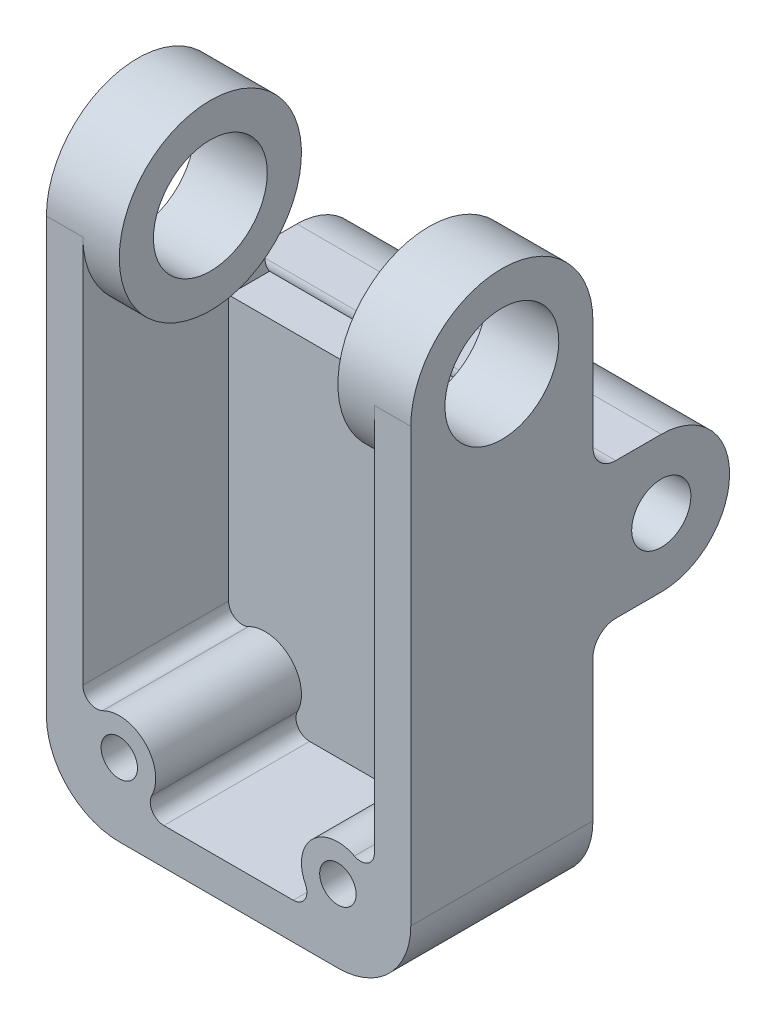
ISO-10303-21;
HEADER;
FILE_DESCRIPTION(('STEP AP214'),'2;1');
FILE_NAME('part.step','',(''),(''),'','','');
FILE_SCHEMA(('AUTOMOTIVE_DESIGN { 1 0 10303 214 1 1 1 1 }'));
ENDSEC;
DATA;
#1=APPLICATION_CONTEXT('core data for automotive mechanical design processes');
#2=APPLICATION_PROTOCOL_DEFINITION('international standard','automotive_design',2000,#1);
#3=PRODUCT_CONTEXT('',#1,'mechanical');
#4=PRODUCT('Part','Part','',(#3));
#5=PRODUCT_RELATED_PRODUCT_CATEGORY('part','',(#4));
#6=PRODUCT_DEFINITION_FORMATION('','',#4);
#7=PRODUCT_DEFINITION_CONTEXT('part definition',#1,'design');
#8=PRODUCT_DEFINITION('design','',#6,#7);
#9=PRODUCT_DEFINITION_SHAPE('','',#8);
#10=(LENGTH_UNIT() NAMED_UNIT(*) SI_UNIT(.MILLI.,.METRE.));
#11=(NAMED_UNIT(*) PLANE_ANGLE_UNIT() SI_UNIT($,.RADIAN.));
#12=(NAMED_UNIT(*) SI_UNIT($,.STERADIAN.) SOLID_ANGLE_UNIT());
#13=UNCERTAINTY_MEASURE_WITH_UNIT(LENGTH_MEASURE(1.E-05),#10,'distance_accuracy_value','');
#14=(GEOMETRIC_REPRESENTATION_CONTEXT(3) GLOBAL_UNCERTAINTY_ASSIGNED_CONTEXT((#13)) GLOBAL_UNIT_ASSIGNED_CONTEXT((#10,
#11,#12)) REPRESENTATION_CONTEXT('',''));
#15=CARTESIAN_POINT('',(0.,0.,0.));
#16=DIRECTION('',(0.,0.,1.));
#17=DIRECTION('',(1.,0.,0.));
#18=AXIS2_PLACEMENT_3D('',#15,#16,#17);
#19=CARTESIAN_POINT('',(0.,0.,0.));
#20=DIRECTION('',(0.,0.,-1.));
#21=DIRECTION('',(-1.,0.,0.));
#22=AXIS2_PLACEMENT_3D('',#19,#20,#21);
#23=PLANE('',#22);
#24=DIRECTION('',(0.,1.,0.));
#25=VECTOR('',#24,1.);
#26=CARTESIAN_POINT('',(40.,84.,0.));
#27=LINE('',#26,#25);
#28=CARTESIAN_POINT('',(40.,87.,0.));
#29=VERTEX_POINT('',#28);
#30=CARTESIAN_POINT('',(40.,111.,0.));
#31=VERTEX_POINT('',#30);
#32=EDGE_CURVE('E219',#29,#31,#27,.T.);
#33=ORIENTED_EDGE('',*,*,#32,.F.);
#34=DIRECTION('',(1.,0.,0.));
#35=VECTOR('',#34,1.);
#36=CARTESIAN_POINT('',(-40.,87.,0.));
#37=LINE('',#36,#35);
#38=CARTESIAN_POINT('',(32.,87.,0.));
#39=VERTEX_POINT('',#38);
#40=EDGE_CURVE('E266',#29,#39,#37,.F.);
#41=ORIENTED_EDGE('',*,*,#40,.T.);
#42=DIRECTION('',(0.,1.,0.));
#43=VECTOR('',#42,1.);
#44=CARTESIAN_POINT('',(32.,0.,0.));
#45=LINE('',#44,#43);
#46=CARTESIAN_POINT('',(32.,111.,0.));
#47=VERTEX_POINT('',#46);
#48=EDGE_CURVE('E451',#39,#47,#45,.T.);
#49=ORIENTED_EDGE('',*,*,#48,.T.);
#50=DIRECTION('',(1.,0.,0.));
#51=VECTOR('',#50,1.);
#52=CARTESIAN_POINT('',(32.,111.,0.));
#53=LINE('',#52,#51);
#54=EDGE_CURVE('E456',#47,#31,#53,.T.);
#55=ORIENTED_EDGE('',*,*,#54,.T.);
#56=EDGE_LOOP('',(#33,#41,#49,#55));
#57=FACE_BOUND('',#56,.T.);
#58=ADVANCED_FACE('F39',(#57),#23,.T.);
#59=DIRECTION('',(0.,1.,0.));
#60=VECTOR('',#59,1.);
#61=CARTESIAN_POINT('',(-32.,0.,0.));
#62=LINE('',#61,#60);
#63=CARTESIAN_POINT('',(-32.,87.,0.));
#64=VERTEX_POINT('',#63);
#65=CARTESIAN_POINT('',(-32.,111.,0.));
#66=VERTEX_POINT('',#65);
#67=EDGE_CURVE('E281',#64,#66,#62,.T.);
#68=ORIENTED_EDGE('',*,*,#67,.F.);
#69=DIRECTION('',(1.,0.,0.));
#70=VECTOR('',#69,1.);
#71=CARTESIAN_POINT('',(-40.,87.,0.));
#72=LINE('',#71,#70);
#73=CARTESIAN_POINT('',(-40.,87.,0.));
#74=VERTEX_POINT('',#73);
#75=EDGE_CURVE('E264',#64,#74,#72,.F.);
#76=ORIENTED_EDGE('',*,*,#75,.T.);
#77=DIRECTION('',(0.,-1.,0.));
#78=VECTOR('',#77,1.);
#79=CARTESIAN_POINT('',(-40.,0.,0.));
#80=LINE('',#79,#78);
#81=CARTESIAN_POINT('',(-40.,111.,0.));
#82=VERTEX_POINT('',#81);
#83=EDGE_CURVE('E228',#82,#74,#80,.T.);
#84=ORIENTED_EDGE('',*,*,#83,.F.);
#85=DIRECTION('',(-1.,0.,0.));
#86=VECTOR('',#85,1.);
#87=CARTESIAN_POINT('',(-32.,111.,0.));
#88=LINE('',#87,#86);
#89=EDGE_CURVE('E289',#66,#82,#88,.T.);
#90=ORIENTED_EDGE('',*,*,#89,.F.);
#91=EDGE_LOOP('',(#68,#76,#84,#90));
#92=FACE_BOUND('',#91,.T.);
#93=ADVANCED_FACE('F287',(#92),#23,.T.);
#94=CARTESIAN_POINT('',(-32.,111.,20.));
#95=DIRECTION('',(-1.,0.,0.));
#96=DIRECTION('',(0.,1.,0.));
#97=AXIS2_PLACEMENT_3D('',#94,#95,#96);
#98=PLANE('',#97);
#99=CARTESIAN_POINT('',(-32.,111.,20.));
#100=DIRECTION('',(1.,0.,0.));
#101=DIRECTION('',(0.,1.,0.));
#102=AXIS2_PLACEMENT_3D('',#99,#100,#101);
#103=CIRCLE('',#102,20.);
#104=CARTESIAN_POINT('',(-32.,111.,40.));
#105=VERTEX_POINT('',#104);
#106=EDGE_CURVE('E349',#105,#66,#103,.T.);
#107=ORIENTED_EDGE('',*,*,#106,.F.);
#108=DIRECTION('',(0.,-1.,0.));
#109=VECTOR('',#108,1.);
#110=CARTESIAN_POINT('',(-32.,0.,40.));
#111=LINE('',#110,#109);
#112=CARTESIAN_POINT('',(-32.,25.7979589711327,40.));
#113=VERTEX_POINT('',#112);
#114=EDGE_CURVE('E291',#105,#113,#111,.T.);
#115=ORIENTED_EDGE('',*,*,#114,.T.);
#116=DIRECTION('',(0.,0.,-1.));
#117=VECTOR('',#116,1.);
#118=CARTESIAN_POINT('',(-32.,25.7979589711327,156.));
#119=LINE('',#118,#117);
#120=CARTESIAN_POINT('',(-32.,25.7979589711327,8.));
#121=VERTEX_POINT('',#120);
#122=EDGE_CURVE('E379',#113,#121,#119,.T.);
#123=ORIENTED_EDGE('',*,*,#122,.T.);
#124=DIRECTION('',(0.,1.,0.));
#125=VECTOR('',#124,1.);
#126=CARTESIAN_POINT('',(-32.,0.,8.));
#127=LINE('',#126,#125);
#128=CARTESIAN_POINT('',(-32.,84.,8.));
#129=VERTEX_POINT('',#128);
#130=EDGE_CURVE('E442',#121,#129,#127,.T.);
#131=ORIENTED_EDGE('',*,*,#130,.T.);
#132=DIRECTION('',(0.,0.,-1.));
#133=VECTOR('',#132,1.);
#134=CARTESIAN_POINT('',(-32.,84.,8.));
#135=LINE('',#134,#133);
#136=CARTESIAN_POINT('',(-32.,84.,-0.99999999999933));
#137=VERTEX_POINT('',#136);
#138=EDGE_CURVE('E54',#129,#137,#135,.T.);
#139=ORIENTED_EDGE('',*,*,#138,.T.);
#140=CARTESIAN_POINT('',(-32.,87.,-5.));
#141=DIRECTION('',(-1.,0.,0.));
#142=DIRECTION('',(0.,-1.,0.));
#143=AXIS2_PLACEMENT_3D('',#140,#141,#142);
#144=CIRCLE('',#143,5.);
#145=EDGE_CURVE('E47',#137,#64,#144,.T.);
#146=ORIENTED_EDGE('',*,*,#145,.T.);
#147=ORIENTED_EDGE('',*,*,#67,.T.);
#148=EDGE_LOOP('',(#107,#115,#123,#131,#139,#146,#147));
#149=FACE_BOUND('',#148,.T.);
#150=ADVANCED_FACE('F280',(#149),#98,.F.);
#151=CARTESIAN_POINT('',(32.,111.,20.));
#152=DIRECTION('',(1.,0.,0.));
#153=DIRECTION('',(0.,1.,0.));
#154=AXIS2_PLACEMENT_3D('',#151,#152,#153);
#155=PLANE('',#154);
#156=DIRECTION('',(0.,-1.,0.));
#157=VECTOR('',#156,1.);
#158=CARTESIAN_POINT('',(32.,0.,40.));
#159=LINE('',#158,#157);
#160=CARTESIAN_POINT('',(32.,111.,40.));
#161=VERTEX_POINT('',#160);
#162=CARTESIAN_POINT('',(32.,25.7979589711327,40.));
#163=VERTEX_POINT('',#162);
#164=EDGE_CURVE('E453',#161,#163,#159,.T.);
#165=ORIENTED_EDGE('',*,*,#164,.F.);
#166=CARTESIAN_POINT('',(32.,111.,20.));
#167=DIRECTION('',(1.,0.,0.));
#168=DIRECTION('',(0.,1.,0.));
#169=AXIS2_PLACEMENT_3D('',#166,#167,#168);
#170=CIRCLE('',#169,20.);
#171=EDGE_CURVE('E340',#161,#47,#170,.T.);
#172=ORIENTED_EDGE('',*,*,#171,.T.);
#173=ORIENTED_EDGE('',*,*,#48,.F.);
#174=CARTESIAN_POINT('',(32.,87.,-5.));
#175=DIRECTION('',(1.,0.,0.));
#176=DIRECTION('',(0.,1.,0.));
#177=AXIS2_PLACEMENT_3D('',#174,#175,#176);
#178=CIRCLE('',#177,5.);
#179=CARTESIAN_POINT('',(32.,84.,-0.999999999999338));
#180=VERTEX_POINT('',#179);
#181=EDGE_CURVE('E274',#39,#180,#178,.T.);
#182=ORIENTED_EDGE('',*,*,#181,.T.);
#183=DIRECTION('',(0.,0.,1.));
#184=VECTOR('',#183,1.);
#185=CARTESIAN_POINT('',(32.,84.,8.));
#186=LINE('',#185,#184);
#187=CARTESIAN_POINT('',(32.,84.,8.));
#188=VERTEX_POINT('',#187);
#189=EDGE_CURVE('E61',#180,#188,#186,.T.);
#190=ORIENTED_EDGE('',*,*,#189,.T.);
#191=DIRECTION('',(0.,-1.,0.));
#192=VECTOR('',#191,1.);
#193=CARTESIAN_POINT('',(32.,0.,8.));
#194=LINE('',#193,#192);
#195=CARTESIAN_POINT('',(32.,25.7979589711327,8.));
#196=VERTEX_POINT('',#195);
#197=EDGE_CURVE('E462',#188,#196,#194,.T.);
#198=ORIENTED_EDGE('',*,*,#197,.T.);
#199=DIRECTION('',(0.,0.,-1.));
#200=VECTOR('',#199,1.);
#201=CARTESIAN_POINT('',(32.,25.7979589711327,156.));
#202=LINE('',#201,#200);
#203=EDGE_CURVE('E382',#163,#196,#202,.T.);
#204=ORIENTED_EDGE('',*,*,#203,.F.);
#205=EDGE_LOOP('',(#165,#172,#173,#182,#190,#198,#204));
#206=FACE_BOUND('',#205,.T.);
#207=ADVANCED_FACE('F474',(#206),#155,.F.);
#208=CARTESIAN_POINT('',(-40.,84.,8.));
#209=DIRECTION('',(0.,-1.,0.));
#210=DIRECTION('',(1.,0.,0.));
#211=AXIS2_PLACEMENT_3D('',#208,#209,#210);
#212=PLANE('',#211);
#213=ORIENTED_EDGE('',*,*,#138,.F.);
#214=DIRECTION('',(-1.,0.,0.));
#215=VECTOR('',#214,1.);
#216=CARTESIAN_POINT('',(-40.,84.,8.));
#217=LINE('',#216,#215);
#218=EDGE_CURVE('E237',#188,#129,#217,.T.);
#219=ORIENTED_EDGE('',*,*,#218,.F.);
#220=ORIENTED_EDGE('',*,*,#189,.F.);
#221=DIRECTION('',(-1.,0.,0.));
#222=VECTOR('',#221,1.);
#223=CARTESIAN_POINT('',(32.,84.,-0.999999999999338));
#224=LINE('',#223,#222);
#225=EDGE_CURVE('E276',#180,#137,#224,.T.);
#226=ORIENTED_EDGE('',*,*,#225,.T.);
#227=EDGE_LOOP('',(#213,#219,#220,#226));
#228=FACE_BOUND('',#227,.T.);
#229=ADVANCED_FACE('F471',(#228),#212,.F.);
#230=CARTESIAN_POINT('',(0.,0.,8.));
#231=DIRECTION('',(0.,0.,-1.));
#232=DIRECTION('',(-1.,0.,0.));
#233=AXIS2_PLACEMENT_3D('',#230,#231,#232);
#234=PLANE('',#233);
#235=CARTESIAN_POINT('',(29.,25.7979589711327,8.00000000000001));
#236=DIRECTION('',(0.,0.,-1.));
#237=DIRECTION('',(-1.,0.,0.));
#238=AXIS2_PLACEMENT_3D('',#235,#236,#237);
#239=CIRCLE('',#238,3.);
#240=CARTESIAN_POINT('',(27.6363636363636,23.125788342642,8.00000000000001));
#241=VERTEX_POINT('',#240);
#242=EDGE_CURVE('E409',#196,#241,#239,.T.);
#243=ORIENTED_EDGE('',*,*,#242,.F.);
#244=ORIENTED_EDGE('',*,*,#197,.F.);
#245=ORIENTED_EDGE('',*,*,#218,.T.);
#246=ORIENTED_EDGE('',*,*,#130,.F.);
#247=CARTESIAN_POINT('',(-29.,25.7979589711327,8.00000000000001));
#248=DIRECTION('',(0.,0.,-1.));
#249=DIRECTION('',(-1.,0.,0.));
#250=AXIS2_PLACEMENT_3D('',#247,#248,#249);
#251=CIRCLE('',#250,3.);
#252=CARTESIAN_POINT('',(-27.6363636363636,23.125788342642,8.00000000000001));
#253=VERTEX_POINT('',#252);
#254=EDGE_CURVE('E404',#253,#121,#251,.T.);
#255=ORIENTED_EDGE('',*,*,#254,.F.);
#256=CARTESIAN_POINT('',(-24.,16.,8.00000000000001));
#257=DIRECTION('',(0.,0.,-1.));
#258=DIRECTION('',(-1.,0.,0.));
#259=AXIS2_PLACEMENT_3D('',#256,#257,#258);
#260=CIRCLE('',#259,8.);
#261=CARTESIAN_POINT('',(-16.874211657358,12.3636363636364,8.00000000000001));
#262=VERTEX_POINT('',#261);
#263=EDGE_CURVE('E418',#262,#253,#260,.F.);
#264=ORIENTED_EDGE('',*,*,#263,.F.);
#265=CARTESIAN_POINT('',(-14.2020410288673,11.,8.00000000000001));
#266=DIRECTION('',(0.,0.,-1.));
#267=DIRECTION('',(-1.,0.,0.));
#268=AXIS2_PLACEMENT_3D('',#265,#266,#267);
#269=CIRCLE('',#268,3.);
#270=CARTESIAN_POINT('',(-14.2020410288673,8.00000000000001,8.00000000000001));
#271=VERTEX_POINT('',#270);
#272=EDGE_CURVE('E421',#271,#262,#269,.T.);
#273=ORIENTED_EDGE('',*,*,#272,.F.);
#274=DIRECTION('',(-1.,0.,0.));
#275=VECTOR('',#274,1.);
#276=CARTESIAN_POINT('',(0.,8.00000000000001,8.));
#277=LINE('',#276,#275);
#278=CARTESIAN_POINT('',(14.2020410288673,8.00000000000001,8.));
#279=VERTEX_POINT('',#278);
#280=EDGE_CURVE('E424',#279,#271,#277,.T.);
#281=ORIENTED_EDGE('',*,*,#280,.F.);
#282=CARTESIAN_POINT('',(14.2020410288673,11.,8.00000000000001));
#283=DIRECTION('',(0.,0.,-1.));
#284=DIRECTION('',(-1.,0.,0.));
#285=AXIS2_PLACEMENT_3D('',#282,#283,#284);
#286=CIRCLE('',#285,3.);
#287=CARTESIAN_POINT('',(16.874211657358,12.3636363636364,8.00000000000001));
#288=VERTEX_POINT('',#287);
#289=EDGE_CURVE('E427',#288,#279,#286,.T.);
#290=ORIENTED_EDGE('',*,*,#289,.F.);
#291=CARTESIAN_POINT('',(24.,16.,8.00000000000001));
#292=DIRECTION('',(0.,0.,-1.));
#293=DIRECTION('',(-1.,0.,0.));
#294=AXIS2_PLACEMENT_3D('',#291,#292,#293);
#295=CIRCLE('',#294,8.);
#296=EDGE_CURVE('E430',#241,#288,#295,.F.);
#297=ORIENTED_EDGE('',*,*,#296,.F.);
#298=EDGE_LOOP('',(#243,#244,#245,#246,#255,#264,#273,#281,#290,#297));
#299=FACE_BOUND('',#298,.T.);
#300=ADVANCED_FACE('F470',(#299),#234,.F.);
#301=CARTESIAN_POINT('',(-40.,0.,8.));
#302=DIRECTION('',(1.,0.,0.));
#303=DIRECTION('',(0.,0.,-1.));
#304=AXIS2_PLACEMENT_3D('',#301,#302,#303);
#305=PLANE('',#304);
#306=DIRECTION('',(0.,0.,-1.));
#307=VECTOR('',#306,1.);
#308=CARTESIAN_POINT('',(-40.,16.,8.));
#309=LINE('',#308,#307);
#310=CARTESIAN_POINT('',(-40.,16.,0.));
#311=VERTEX_POINT('',#310);
#312=CARTESIAN_POINT('',(-40.,16.,40.));
#313=VERTEX_POINT('',#312);
#314=EDGE_CURVE('E244',#311,#313,#309,.F.);
#315=ORIENTED_EDGE('',*,*,#314,.T.);
#316=DIRECTION('',(0.,-1.,0.));
#317=VECTOR('',#316,1.);
#318=CARTESIAN_POINT('',(-40.,0.,40.));
#319=LINE('',#318,#317);
#320=CARTESIAN_POINT('',(-40.,111.,40.));
#321=VERTEX_POINT('',#320);
#322=EDGE_CURVE('E435',#321,#313,#319,.T.);
#323=ORIENTED_EDGE('',*,*,#322,.F.);
#324=CARTESIAN_POINT('',(-40.,111.,20.));
#325=DIRECTION('',(1.,0.,0.));
#326=DIRECTION('',(0.,1.,0.));
#327=AXIS2_PLACEMENT_3D('',#324,#325,#326);
#328=CIRCLE('',#327,20.);
#329=EDGE_CURVE('E292',#82,#321,#328,.T.);
#330=ORIENTED_EDGE('',*,*,#329,.F.);
#331=ORIENTED_EDGE('',*,*,#83,.T.);
#332=CARTESIAN_POINT('',(-40.,87.,-5.));
#333=DIRECTION('',(1.,0.,0.));
#334=DIRECTION('',(0.,0.,-1.));
#335=AXIS2_PLACEMENT_3D('',#332,#333,#334);
#336=CIRCLE('',#335,5.);
#337=CARTESIAN_POINT('',(-40.,82.,-5.));
#338=VERTEX_POINT('',#337);
#339=EDGE_CURVE('E11',#74,#338,#336,.T.);
#340=ORIENTED_EDGE('',*,*,#339,.T.);
#341=DIRECTION('',(0.,0.,-1.));
#342=VECTOR('',#341,1.);
#343=CARTESIAN_POINT('',(-40.,82.,0.));
#344=LINE('',#343,#342);
#345=CARTESIAN_POINT('',(-40.,82.,-15.));
#346=VERTEX_POINT('',#345);
#347=EDGE_CURVE('E301',#338,#346,#344,.T.);
#348=ORIENTED_EDGE('',*,*,#347,.T.);
#349=CARTESIAN_POINT('',(-40.,67.,-15.));
#350=DIRECTION('',(1.,0.,0.));
#351=DIRECTION('',(0.,0.,-1.));
#352=AXIS2_PLACEMENT_3D('',#349,#350,#351);
#353=CIRCLE('',#352,15.);
#354=CARTESIAN_POINT('',(-40.,52.,-15.));
#355=VERTEX_POINT('',#354);
#356=EDGE_CURVE('E311',#346,#355,#353,.F.);
#357=ORIENTED_EDGE('',*,*,#356,.T.);
#358=DIRECTION('',(0.,0.,1.));
#359=VECTOR('',#358,1.);
#360=CARTESIAN_POINT('',(-40.,52.,-15.));
#361=LINE('',#360,#359);
#362=CARTESIAN_POINT('',(-40.,52.,-5.));
#363=VERTEX_POINT('',#362);
#364=EDGE_CURVE('E316',#355,#363,#361,.T.);
#365=ORIENTED_EDGE('',*,*,#364,.T.);
#366=CARTESIAN_POINT('',(-40.,47.,-5.));
#367=DIRECTION('',(1.,0.,0.));
#368=DIRECTION('',(0.,0.,-1.));
#369=AXIS2_PLACEMENT_3D('',#366,#367,#368);
#370=CIRCLE('',#369,5.);
#371=CARTESIAN_POINT('',(-40.,47.,0.));
#372=VERTEX_POINT('',#371);
#373=EDGE_CURVE('E270',#363,#372,#370,.T.);
#374=ORIENTED_EDGE('',*,*,#373,.T.);
#375=EDGE_CURVE('E230',#372,#311,#80,.T.);
#376=ORIENTED_EDGE('',*,*,#375,.T.);
#377=EDGE_LOOP('',(#315,#323,#330,#331,#340,#348,#357,#365,#374,#376));
#378=FACE_BOUND('',#377,.T.);
#379=CARTESIAN_POINT('',(-40.,111.,20.));
#380=DIRECTION('',(1.,0.,0.));
#381=DIRECTION('',(0.,1.,0.));
#382=AXIS2_PLACEMENT_3D('',#379,#380,#381);
#383=CIRCLE('',#382,12.5);
#384=CARTESIAN_POINT('',(-40.,123.5,20.));
#385=VERTEX_POINT('',#384);
#386=EDGE_CURVE('E433',#385,#385,#383,.T.);
#387=ORIENTED_EDGE('',*,*,#386,.T.);
#388=EDGE_LOOP('',(#387));
#389=FACE_BOUND('',#388,.T.);
#390=CARTESIAN_POINT('',(-40.,67.,-15.));
#391=DIRECTION('',(1.,0.,0.));
#392=DIRECTION('',(0.,0.,-1.));
#393=AXIS2_PLACEMENT_3D('',#390,#391,#392);
#394=CIRCLE('',#393,6.5);
#395=CARTESIAN_POINT('',(-40.,67.,-21.5));
#396=VERTEX_POINT('',#395);
#397=EDGE_CURVE('E310',#396,#396,#394,.F.);
#398=ORIENTED_EDGE('',*,*,#397,.F.);
#399=EDGE_LOOP('',(#398));
#400=FACE_BOUND('',#399,.T.);
#401=ADVANCED_FACE('F299',(#378,#389,#400),#305,.F.);
#402=CARTESIAN_POINT('',(40.,0.,8.));
#403=DIRECTION('',(0.,1.,0.));
#404=DIRECTION('',(-1.,0.,0.));
#405=AXIS2_PLACEMENT_3D('',#402,#403,#404);
#406=PLANE('',#405);
#407=DIRECTION('',(1.,0.,0.));
#408=VECTOR('',#407,1.);
#409=CARTESIAN_POINT('',(40.,0.,0.));
#410=LINE('',#409,#408);
#411=CARTESIAN_POINT('',(-24.,0.,0.));
#412=VERTEX_POINT('',#411);
#413=CARTESIAN_POINT('',(0.,0.,0.));
#414=VERTEX_POINT('',#413);
#415=EDGE_CURVE('E210',#412,#414,#410,.T.);
#416=ORIENTED_EDGE('',*,*,#415,.T.);
#417=CARTESIAN_POINT('',(0.,0.,16.));
#418=DIRECTION('',(0.,-1.,0.));
#419=DIRECTION('',(1.,0.,0.));
#420=AXIS2_PLACEMENT_3D('',#417,#418,#419);
#421=CIRCLE('',#420,16.);
#422=EDGE_CURVE('E214',#414,#414,#421,.T.);
#423=ORIENTED_EDGE('',*,*,#422,.F.);
#424=CARTESIAN_POINT('',(24.,0.,0.));
#425=VERTEX_POINT('',#424);
#426=EDGE_CURVE('E220',#414,#425,#410,.T.);
#427=ORIENTED_EDGE('',*,*,#426,.T.);
#428=DIRECTION('',(0.,0.,-1.));
#429=VECTOR('',#428,1.);
#430=CARTESIAN_POINT('',(24.,0.,8.));
#431=LINE('',#430,#429);
#432=CARTESIAN_POINT('',(23.9999999999999,0.,40.));
#433=VERTEX_POINT('',#432);
#434=EDGE_CURVE('E238',#425,#433,#431,.F.);
#435=ORIENTED_EDGE('',*,*,#434,.T.);
#436=DIRECTION('',(-1.,0.,0.));
#437=VECTOR('',#436,1.);
#438=CARTESIAN_POINT('',(-23.9999999999999,0.,40.));
#439=LINE('',#438,#437);
#440=CARTESIAN_POINT('',(-23.9999999999999,0.,40.));
#441=VERTEX_POINT('',#440);
#442=EDGE_CURVE('E381',#433,#441,#439,.T.);
#443=ORIENTED_EDGE('',*,*,#442,.T.);
#444=DIRECTION('',(0.,0.,-1.));
#445=VECTOR('',#444,1.);
#446=CARTESIAN_POINT('',(-24.,0.,8.));
#447=LINE('',#446,#445);
#448=EDGE_CURVE('E216',#441,#412,#447,.T.);
#449=ORIENTED_EDGE('',*,*,#448,.T.);
#450=EDGE_LOOP('',(#416,#423,#427,#435,#443,#449));
#451=FACE_BOUND('',#450,.T.);
#452=ADVANCED_FACE('F212',(#451),#406,.F.);
#453=CARTESIAN_POINT('',(40.,84.,8.));
#454=DIRECTION('',(-1.,0.,0.));
#455=DIRECTION('',(0.,-1.,0.));
#456=AXIS2_PLACEMENT_3D('',#453,#454,#455);
#457=PLANE('',#456);
#458=CARTESIAN_POINT('',(40.,16.,0.));
#459=VERTEX_POINT('',#458);
#460=CARTESIAN_POINT('',(40.,47.,0.));
#461=VERTEX_POINT('',#460);
#462=EDGE_CURVE('E234',#459,#461,#27,.T.);
#463=ORIENTED_EDGE('',*,*,#462,.T.);
#464=CARTESIAN_POINT('',(40.,47.,-5.));
#465=DIRECTION('',(-1.,0.,0.));
#466=DIRECTION('',(0.,-1.,0.));
#467=AXIS2_PLACEMENT_3D('',#464,#465,#466);
#468=CIRCLE('',#467,5.);
#469=CARTESIAN_POINT('',(40.,52.,-5.));
#470=VERTEX_POINT('',#469);
#471=EDGE_CURVE('E268',#461,#470,#468,.T.);
#472=ORIENTED_EDGE('',*,*,#471,.T.);
#473=DIRECTION('',(0.,0.,-1.));
#474=VECTOR('',#473,1.);
#475=CARTESIAN_POINT('',(40.,52.,-15.));
#476=LINE('',#475,#474);
#477=CARTESIAN_POINT('',(40.,52.,-15.));
#478=VERTEX_POINT('',#477);
#479=EDGE_CURVE('E333',#470,#478,#476,.T.);
#480=ORIENTED_EDGE('',*,*,#479,.T.);
#481=CARTESIAN_POINT('',(40.,67.,-15.));
#482=DIRECTION('',(1.,0.,0.));
#483=DIRECTION('',(0.,1.,0.));
#484=AXIS2_PLACEMENT_3D('',#481,#482,#483);
#485=CIRCLE('',#484,15.);
#486=CARTESIAN_POINT('',(40.,82.,-15.));
#487=VERTEX_POINT('',#486);
#488=EDGE_CURVE('E327',#478,#487,#485,.T.);
#489=ORIENTED_EDGE('',*,*,#488,.T.);
#490=DIRECTION('',(0.,0.,1.));
#491=VECTOR('',#490,1.);
#492=CARTESIAN_POINT('',(40.,82.,0.));
#493=LINE('',#492,#491);
#494=CARTESIAN_POINT('',(40.,82.,-5.));
#495=VERTEX_POINT('',#494);
#496=EDGE_CURVE('E331',#487,#495,#493,.T.);
#497=ORIENTED_EDGE('',*,*,#496,.T.);
#498=CARTESIAN_POINT('',(40.,87.,-5.));
#499=DIRECTION('',(-1.,0.,0.));
#500=DIRECTION('',(0.,-1.,0.));
#501=AXIS2_PLACEMENT_3D('',#498,#499,#500);
#502=CIRCLE('',#501,5.);
#503=EDGE_CURVE('E272',#495,#29,#502,.T.);
#504=ORIENTED_EDGE('',*,*,#503,.T.);
#505=ORIENTED_EDGE('',*,*,#32,.T.);
#506=CARTESIAN_POINT('',(40.,111.,20.));
#507=DIRECTION('',(1.,0.,0.));
#508=DIRECTION('',(0.,1.,0.));
#509=AXIS2_PLACEMENT_3D('',#506,#507,#508);
#510=CIRCLE('',#509,20.);
#511=CARTESIAN_POINT('',(40.,111.,40.));
#512=VERTEX_POINT('',#511);
#513=EDGE_CURVE('E450',#31,#512,#510,.T.);
#514=ORIENTED_EDGE('',*,*,#513,.T.);
#515=DIRECTION('',(0.,-1.,0.));
#516=VECTOR('',#515,1.);
#517=CARTESIAN_POINT('',(40.,0.,40.));
#518=LINE('',#517,#516);
#519=CARTESIAN_POINT('',(40.,16.,40.));
#520=VERTEX_POINT('',#519);
#521=EDGE_CURVE('E454',#512,#520,#518,.T.);
#522=ORIENTED_EDGE('',*,*,#521,.T.);
#523=DIRECTION('',(0.,0.,-1.));
#524=VECTOR('',#523,1.);
#525=CARTESIAN_POINT('',(40.,16.,8.));
#526=LINE('',#525,#524);
#527=EDGE_CURVE('E250',#520,#459,#526,.T.);
#528=ORIENTED_EDGE('',*,*,#527,.T.);
#529=EDGE_LOOP('',(#463,#472,#480,#489,#497,#504,#505,#514,#522,#528));
#530=FACE_BOUND('',#529,.T.);
#531=CARTESIAN_POINT('',(40.,111.,20.));
#532=DIRECTION('',(1.,0.,0.));
#533=DIRECTION('',(0.,1.,0.));
#534=AXIS2_PLACEMENT_3D('',#531,#532,#533);
#535=CIRCLE('',#534,12.5);
#536=CARTESIAN_POINT('',(40.,123.5,20.));
#537=VERTEX_POINT('',#536);
#538=EDGE_CURVE('E447',#537,#537,#535,.T.);
#539=ORIENTED_EDGE('',*,*,#538,.F.);
#540=EDGE_LOOP('',(#539));
#541=FACE_BOUND('',#540,.T.);
#542=CARTESIAN_POINT('',(40.,67.,-15.));
#543=DIRECTION('',(1.,0.,0.));
#544=DIRECTION('',(0.,1.,0.));
#545=AXIS2_PLACEMENT_3D('',#542,#543,#544);
#546=CIRCLE('',#545,6.5);
#547=CARTESIAN_POINT('',(40.,73.5,-15.));
#548=VERTEX_POINT('',#547);
#549=EDGE_CURVE('E324',#548,#548,#546,.T.);
#550=ORIENTED_EDGE('',*,*,#549,.F.);
#551=EDGE_LOOP('',(#550));
#552=FACE_BOUND('',#551,.T.);
#553=ADVANCED_FACE('F483',(#530,#541,#552),#457,.F.);
#554=ORIENTED_EDGE('',*,*,#375,.F.);
#555=DIRECTION('',(1.,0.,0.));
#556=VECTOR('',#555,1.);
#557=CARTESIAN_POINT('',(40.,47.,0.));
#558=LINE('',#557,#556);
#559=EDGE_CURVE('E256',#372,#461,#558,.T.);
#560=ORIENTED_EDGE('',*,*,#559,.T.);
#561=ORIENTED_EDGE('',*,*,#462,.F.);
#562=CARTESIAN_POINT('',(24.,16.,0.));
#563=DIRECTION('',(0.,0.,-1.));
#564=DIRECTION('',(-1.,0.,0.));
#565=AXIS2_PLACEMENT_3D('',#562,#563,#564);
#566=CIRCLE('',#565,16.);
#567=EDGE_CURVE('E226',#459,#425,#566,.T.);
#568=ORIENTED_EDGE('',*,*,#567,.T.);
#569=ORIENTED_EDGE('',*,*,#426,.F.);
#570=ORIENTED_EDGE('',*,*,#415,.F.);
#571=CARTESIAN_POINT('',(-24.,16.,0.));
#572=DIRECTION('',(0.,0.,-1.));
#573=DIRECTION('',(-1.,0.,0.));
#574=AXIS2_PLACEMENT_3D('',#571,#572,#573);
#575=CIRCLE('',#574,16.);
#576=EDGE_CURVE('E242',#412,#311,#575,.T.);
#577=ORIENTED_EDGE('',*,*,#576,.T.);
#578=EDGE_LOOP('',(#554,#560,#561,#568,#569,#570,#577));
#579=FACE_BOUND('',#578,.T.);
#580=ADVANCED_FACE('F224',(#579),#23,.T.);
#581=CARTESIAN_POINT('',(32.,0.,40.));
#582=DIRECTION('',(0.,0.,1.));
#583=DIRECTION('',(0.,-1.,0.));
#584=AXIS2_PLACEMENT_3D('',#581,#582,#583);
#585=PLANE('',#584);
#586=CARTESIAN_POINT('',(24.,16.,40.));
#587=DIRECTION('',(0.,0.,1.));
#588=DIRECTION('',(0.,-1.,0.));
#589=AXIS2_PLACEMENT_3D('',#586,#587,#588);
#590=CIRCLE('',#589,16.);
#591=EDGE_CURVE('E253',#433,#520,#590,.T.);
#592=ORIENTED_EDGE('',*,*,#591,.T.);
#593=ORIENTED_EDGE('',*,*,#521,.F.);
#594=DIRECTION('',(1.,0.,0.));
#595=VECTOR('',#594,1.);
#596=CARTESIAN_POINT('',(32.,111.,40.));
#597=LINE('',#596,#595);
#598=EDGE_CURVE('E460',#161,#512,#597,.T.);
#599=ORIENTED_EDGE('',*,*,#598,.F.);
#600=ORIENTED_EDGE('',*,*,#164,.T.);
#601=CARTESIAN_POINT('',(29.,25.7979589711327,40.));
#602=DIRECTION('',(0.,0.,-1.));
#603=DIRECTION('',(0.,1.,0.));
#604=AXIS2_PLACEMENT_3D('',#601,#602,#603);
#605=CIRCLE('',#604,3.);
#606=CARTESIAN_POINT('',(27.6363636363636,23.125788342642,40.));
#607=VERTEX_POINT('',#606);
#608=EDGE_CURVE('E353',#607,#163,#605,.F.);
#609=ORIENTED_EDGE('',*,*,#608,.F.);
#610=CARTESIAN_POINT('',(24.,16.,40.));
#611=DIRECTION('',(0.,0.,-1.));
#612=DIRECTION('',(0.,1.,0.));
#613=AXIS2_PLACEMENT_3D('',#610,#611,#612);
#614=CIRCLE('',#613,8.);
#615=CARTESIAN_POINT('',(16.874211657358,12.3636363636364,40.));
#616=VERTEX_POINT('',#615);
#617=EDGE_CURVE('E359',#616,#607,#614,.T.);
#618=ORIENTED_EDGE('',*,*,#617,.F.);
#619=CARTESIAN_POINT('',(14.2020410288673,11.,40.));
#620=DIRECTION('',(0.,0.,-1.));
#621=DIRECTION('',(0.,1.,0.));
#622=AXIS2_PLACEMENT_3D('',#619,#620,#621);
#623=CIRCLE('',#622,3.);
#624=CARTESIAN_POINT('',(14.2020410288673,8.00000000000001,40.));
#625=VERTEX_POINT('',#624);
#626=EDGE_CURVE('E358',#625,#616,#623,.F.);
#627=ORIENTED_EDGE('',*,*,#626,.F.);
#628=DIRECTION('',(1.,0.,0.));
#629=VECTOR('',#628,1.);
#630=CARTESIAN_POINT('',(-14.2020410288673,8.00000000000001,40.));
#631=LINE('',#630,#629);
#632=CARTESIAN_POINT('',(-14.2020410288673,8.00000000000001,40.));
#633=VERTEX_POINT('',#632);
#634=EDGE_CURVE('E363',#633,#625,#631,.T.);
#635=ORIENTED_EDGE('',*,*,#634,.F.);
#636=CARTESIAN_POINT('',(-14.2020410288673,11.,40.));
#637=DIRECTION('',(0.,0.,-1.));
#638=DIRECTION('',(0.,1.,0.));
#639=AXIS2_PLACEMENT_3D('',#636,#637,#638);
#640=CIRCLE('',#639,3.);
#641=CARTESIAN_POINT('',(-16.874211657358,12.3636363636364,40.));
#642=VERTEX_POINT('',#641);
#643=EDGE_CURVE('E367',#642,#633,#640,.F.);
#644=ORIENTED_EDGE('',*,*,#643,.F.);
#645=CARTESIAN_POINT('',(-24.,16.,40.));
#646=DIRECTION('',(0.,0.,-1.));
#647=DIRECTION('',(0.,1.,0.));
#648=AXIS2_PLACEMENT_3D('',#645,#646,#647);
#649=CIRCLE('',#648,8.);
#650=CARTESIAN_POINT('',(-27.6363636363636,23.125788342642,40.));
#651=VERTEX_POINT('',#650);
#652=EDGE_CURVE('E371',#651,#642,#649,.T.);
#653=ORIENTED_EDGE('',*,*,#652,.F.);
#654=CARTESIAN_POINT('',(-29.,25.7979589711327,40.));
#655=DIRECTION('',(0.,0.,-1.));
#656=DIRECTION('',(0.,1.,0.));
#657=AXIS2_PLACEMENT_3D('',#654,#655,#656);
#658=CIRCLE('',#657,3.);
#659=EDGE_CURVE('E375',#113,#651,#658,.F.);
#660=ORIENTED_EDGE('',*,*,#659,.F.);
#661=ORIENTED_EDGE('',*,*,#114,.F.);
#662=DIRECTION('',(-1.,0.,0.));
#663=VECTOR('',#662,1.);
#664=CARTESIAN_POINT('',(-32.,111.,40.));
#665=LINE('',#664,#663);
#666=EDGE_CURVE('E438',#105,#321,#665,.T.);
#667=ORIENTED_EDGE('',*,*,#666,.T.);
#668=ORIENTED_EDGE('',*,*,#322,.T.);
#669=CARTESIAN_POINT('',(-24.,16.,40.));
#670=DIRECTION('',(0.,0.,-1.));
#671=DIRECTION('',(0.,1.,0.));
#672=AXIS2_PLACEMENT_3D('',#669,#670,#671);
#673=CIRCLE('',#672,16.);
#674=EDGE_CURVE('E247',#313,#441,#673,.F.);
#675=ORIENTED_EDGE('',*,*,#674,.T.);
#676=ORIENTED_EDGE('',*,*,#442,.F.);
#677=EDGE_LOOP('',(#592,#593,#599,#600,#609,#618,#627,#635,#644,#653,#660,#661,#667,#668,#675,#676));
#678=FACE_BOUND('',#677,.T.);
#679=CARTESIAN_POINT('',(24.,16.,40.));
#680=DIRECTION('',(0.,0.,-1.));
#681=DIRECTION('',(0.,1.,0.));
#682=AXIS2_PLACEMENT_3D('',#679,#680,#681);
#683=CIRCLE('',#682,4.);
#684=CARTESIAN_POINT('',(24.,20.,40.));
#685=VERTEX_POINT('',#684);
#686=EDGE_CURVE('E400',#685,#685,#683,.T.);
#687=ORIENTED_EDGE('',*,*,#686,.T.);
#688=EDGE_LOOP('',(#687));
#689=FACE_BOUND('',#688,.T.);
#690=CARTESIAN_POINT('',(-24.,16.,40.));
#691=DIRECTION('',(0.,0.,-1.));
#692=DIRECTION('',(0.,1.,0.));
#693=AXIS2_PLACEMENT_3D('',#690,#691,#692);
#694=CIRCLE('',#693,4.);
#695=CARTESIAN_POINT('',(-24.,20.,40.));
#696=VERTEX_POINT('',#695);
#697=EDGE_CURVE('E401',#696,#696,#694,.T.);
#698=ORIENTED_EDGE('',*,*,#697,.T.);
#699=EDGE_LOOP('',(#698));
#700=FACE_BOUND('',#699,.T.);
#701=ADVANCED_FACE('F504',(#678,#689,#700),#585,.T.);
#702=CARTESIAN_POINT('',(32.,111.,20.));
#703=DIRECTION('',(1.,0.,0.));
#704=DIRECTION('',(0.,1.,0.));
#705=AXIS2_PLACEMENT_3D('',#702,#703,#704);
#706=CYLINDRICAL_SURFACE('',#705,20.);
#707=ORIENTED_EDGE('',*,*,#513,.F.);
#708=ORIENTED_EDGE('',*,*,#54,.F.);
#709=ORIENTED_EDGE('',*,*,#171,.F.);
#710=ORIENTED_EDGE('',*,*,#598,.T.);
#711=EDGE_LOOP('',(#707,#708,#709,#710));
#712=FACE_BOUND('',#711,.T.);
#713=CARTESIAN_POINT('',(24.,111.,20.));
#714=DIRECTION('',(1.,0.,0.));
#715=DIRECTION('',(0.,1.,0.));
#716=AXIS2_PLACEMENT_3D('',#713,#714,#715);
#717=CIRCLE('',#716,20.);
#718=CARTESIAN_POINT('',(24.,131.,20.));
#719=VERTEX_POINT('',#718);
#720=EDGE_CURVE('E341',#719,#719,#717,.T.);
#721=ORIENTED_EDGE('',*,*,#720,.T.);
#722=EDGE_LOOP('',(#721));
#723=FACE_BOUND('',#722,.T.);
#724=ADVANCED_FACE('F536',(#712,#723),#706,.T.);
#725=CARTESIAN_POINT('',(32.,111.,20.));
#726=DIRECTION('',(1.,0.,0.));
#727=DIRECTION('',(0.,1.,0.));
#728=AXIS2_PLACEMENT_3D('',#725,#726,#727);
#729=CYLINDRICAL_SURFACE('',#728,12.5);
#730=ORIENTED_EDGE('',*,*,#538,.T.);
#731=EDGE_LOOP('',(#730));
#732=FACE_BOUND('',#731,.T.);
#733=CARTESIAN_POINT('',(24.,111.,20.));
#734=DIRECTION('',(1.,0.,0.));
#735=DIRECTION('',(0.,1.,0.));
#736=AXIS2_PLACEMENT_3D('',#733,#734,#735);
#737=CIRCLE('',#736,12.5);
#738=CARTESIAN_POINT('',(24.,123.5,20.));
#739=VERTEX_POINT('',#738);
#740=EDGE_CURVE('E314',#739,#739,#737,.T.);
#741=ORIENTED_EDGE('',*,*,#740,.F.);
#742=EDGE_LOOP('',(#741));
#743=FACE_BOUND('',#742,.T.);
#744=ADVANCED_FACE('F539',(#732,#743),#729,.F.);
#745=CARTESIAN_POINT('',(-32.,111.,20.));
#746=DIRECTION('',(-1.,0.,0.));
#747=DIRECTION('',(0.,-1.,0.));
#748=AXIS2_PLACEMENT_3D('',#745,#746,#747);
#749=CYLINDRICAL_SURFACE('',#748,20.);
#750=ORIENTED_EDGE('',*,*,#329,.T.);
#751=ORIENTED_EDGE('',*,*,#666,.F.);
#752=ORIENTED_EDGE('',*,*,#106,.T.);
#753=ORIENTED_EDGE('',*,*,#89,.T.);
#754=EDGE_LOOP('',(#750,#751,#752,#753));
#755=FACE_BOUND('',#754,.T.);
#756=CARTESIAN_POINT('',(-24.,111.,20.));
#757=DIRECTION('',(1.,0.,0.));
#758=DIRECTION('',(0.,1.,0.));
#759=AXIS2_PLACEMENT_3D('',#756,#757,#758);
#760=CIRCLE('',#759,20.);
#761=CARTESIAN_POINT('',(-24.,131.,20.));
#762=VERTEX_POINT('',#761);
#763=EDGE_CURVE('E350',#762,#762,#760,.T.);
#764=ORIENTED_EDGE('',*,*,#763,.F.);
#765=EDGE_LOOP('',(#764));
#766=FACE_BOUND('',#765,.T.);
#767=ADVANCED_FACE('F510',(#755,#766),#749,.T.);
#768=CARTESIAN_POINT('',(-32.,111.,20.));
#769=DIRECTION('',(-1.,0.,0.));
#770=DIRECTION('',(0.,-1.,0.));
#771=AXIS2_PLACEMENT_3D('',#768,#769,#770);
#772=CYLINDRICAL_SURFACE('',#771,12.5);
#773=ORIENTED_EDGE('',*,*,#386,.F.);
#774=EDGE_LOOP('',(#773));
#775=FACE_BOUND('',#774,.T.);
#776=CARTESIAN_POINT('',(-24.,111.,20.));
#777=DIRECTION('',(1.,0.,0.));
#778=DIRECTION('',(0.,1.,0.));
#779=AXIS2_PLACEMENT_3D('',#776,#777,#778);
#780=CIRCLE('',#779,12.5);
#781=CARTESIAN_POINT('',(-24.,123.5,20.));
#782=VERTEX_POINT('',#781);
#783=EDGE_CURVE('E344',#782,#782,#780,.T.);
#784=ORIENTED_EDGE('',*,*,#783,.T.);
#785=EDGE_LOOP('',(#784));
#786=FACE_BOUND('',#785,.T.);
#787=ADVANCED_FACE('F587',(#775,#786),#772,.F.);
#788=CARTESIAN_POINT('',(-24.,16.,8.));
#789=DIRECTION('',(0.,0.,-1.));
#790=DIRECTION('',(-1.,0.,0.));
#791=AXIS2_PLACEMENT_3D('',#788,#789,#790);
#792=CYLINDRICAL_SURFACE('',#791,16.);
#793=ORIENTED_EDGE('',*,*,#448,.F.);
#794=ORIENTED_EDGE('',*,*,#674,.F.);
#795=ORIENTED_EDGE('',*,*,#314,.F.);
#796=ORIENTED_EDGE('',*,*,#576,.F.);
#797=EDGE_LOOP('',(#793,#794,#795,#796));
#798=FACE_BOUND('',#797,.T.);
#799=ADVANCED_FACE('F501',(#798),#792,.T.);
#800=CARTESIAN_POINT('',(24.,16.,8.));
#801=DIRECTION('',(0.,0.,-1.));
#802=DIRECTION('',(-1.,0.,0.));
#803=AXIS2_PLACEMENT_3D('',#800,#801,#802);
#804=CYLINDRICAL_SURFACE('',#803,16.);
#805=ORIENTED_EDGE('',*,*,#591,.F.);
#806=ORIENTED_EDGE('',*,*,#434,.F.);
#807=ORIENTED_EDGE('',*,*,#567,.F.);
#808=ORIENTED_EDGE('',*,*,#527,.F.);
#809=EDGE_LOOP('',(#805,#806,#807,#808));
#810=FACE_BOUND('',#809,.T.);
#811=ADVANCED_FACE('F586',(#810),#804,.T.);
#812=CARTESIAN_POINT('',(24.,16.,156.));
#813=DIRECTION('',(0.,0.,-1.));
#814=DIRECTION('',(-1.,0.,0.));
#815=AXIS2_PLACEMENT_3D('',#812,#813,#814);
#816=CYLINDRICAL_SURFACE('',#815,8.);
#817=DIRECTION('',(0.,0.,-1.));
#818=VECTOR('',#817,1.);
#819=CARTESIAN_POINT('',(27.6363636363636,23.125788342642,156.));
#820=LINE('',#819,#818);
#821=EDGE_CURVE('E355',#607,#241,#820,.T.);
#822=ORIENTED_EDGE('',*,*,#821,.T.);
#823=ORIENTED_EDGE('',*,*,#296,.T.);
#824=DIRECTION('',(0.,0.,-1.));
#825=VECTOR('',#824,1.);
#826=CARTESIAN_POINT('',(16.874211657358,12.3636363636364,156.));
#827=LINE('',#826,#825);
#828=EDGE_CURVE('E360',#616,#288,#827,.T.);
#829=ORIENTED_EDGE('',*,*,#828,.F.);
#830=ORIENTED_EDGE('',*,*,#617,.T.);
#831=EDGE_LOOP('',(#822,#823,#829,#830));
#832=FACE_BOUND('',#831,.T.);
#833=ADVANCED_FACE('F529',(#832),#816,.T.);
#834=CARTESIAN_POINT('',(14.2020410288673,11.,156.));
#835=DIRECTION('',(0.,0.,-1.));
#836=DIRECTION('',(-1.,0.,0.));
#837=AXIS2_PLACEMENT_3D('',#834,#835,#836);
#838=CYLINDRICAL_SURFACE('',#837,3.);
#839=ORIENTED_EDGE('',*,*,#828,.T.);
#840=ORIENTED_EDGE('',*,*,#289,.T.);
#841=DIRECTION('',(0.,0.,-1.));
#842=VECTOR('',#841,1.);
#843=CARTESIAN_POINT('',(14.2020410288673,8.00000000000001,156.));
#844=LINE('',#843,#842);
#845=EDGE_CURVE('E364',#625,#279,#844,.T.);
#846=ORIENTED_EDGE('',*,*,#845,.F.);
#847=ORIENTED_EDGE('',*,*,#626,.T.);
#848=EDGE_LOOP('',(#839,#840,#846,#847));
#849=FACE_BOUND('',#848,.T.);
#850=ADVANCED_FACE('F526',(#849),#838,.F.);
#851=CARTESIAN_POINT('',(-14.2020410288673,8.00000000000001,156.));
#852=DIRECTION('',(0.,-1.,0.));
#853=DIRECTION('',(1.,0.,0.));
#854=AXIS2_PLACEMENT_3D('',#851,#852,#853);
#855=PLANE('',#854);
#856=ORIENTED_EDGE('',*,*,#845,.T.);
#857=ORIENTED_EDGE('',*,*,#280,.T.);
#858=DIRECTION('',(0.,0.,-1.));
#859=VECTOR('',#858,1.);
#860=CARTESIAN_POINT('',(-14.2020410288673,8.00000000000001,156.));
#861=LINE('',#860,#859);
#862=EDGE_CURVE('E368',#633,#271,#861,.T.);
#863=ORIENTED_EDGE('',*,*,#862,.F.);
#864=ORIENTED_EDGE('',*,*,#634,.T.);
#865=EDGE_LOOP('',(#856,#857,#863,#864));
#866=FACE_BOUND('',#865,.T.);
#867=ADVANCED_FACE('F523',(#866),#855,.F.);
#868=CARTESIAN_POINT('',(-14.2020410288673,11.,156.));
#869=DIRECTION('',(0.,0.,-1.));
#870=DIRECTION('',(-1.,0.,0.));
#871=AXIS2_PLACEMENT_3D('',#868,#869,#870);
#872=CYLINDRICAL_SURFACE('',#871,3.);
#873=ORIENTED_EDGE('',*,*,#862,.T.);
#874=ORIENTED_EDGE('',*,*,#272,.T.);
#875=DIRECTION('',(0.,0.,-1.));
#876=VECTOR('',#875,1.);
#877=CARTESIAN_POINT('',(-16.874211657358,12.3636363636364,156.));
#878=LINE('',#877,#876);
#879=EDGE_CURVE('E372',#642,#262,#878,.T.);
#880=ORIENTED_EDGE('',*,*,#879,.F.);
#881=ORIENTED_EDGE('',*,*,#643,.T.);
#882=EDGE_LOOP('',(#873,#874,#880,#881));
#883=FACE_BOUND('',#882,.T.);
#884=ADVANCED_FACE('F520',(#883),#872,.F.);
#885=CARTESIAN_POINT('',(-24.,16.,156.));
#886=DIRECTION('',(0.,0.,-1.));
#887=DIRECTION('',(-1.,0.,0.));
#888=AXIS2_PLACEMENT_3D('',#885,#886,#887);
#889=CYLINDRICAL_SURFACE('',#888,8.);
#890=ORIENTED_EDGE('',*,*,#879,.T.);
#891=ORIENTED_EDGE('',*,*,#263,.T.);
#892=DIRECTION('',(0.,0.,-1.));
#893=VECTOR('',#892,1.);
#894=CARTESIAN_POINT('',(-27.6363636363636,23.125788342642,156.));
#895=LINE('',#894,#893);
#896=EDGE_CURVE('E376',#651,#253,#895,.T.);
#897=ORIENTED_EDGE('',*,*,#896,.F.);
#898=ORIENTED_EDGE('',*,*,#652,.T.);
#899=EDGE_LOOP('',(#890,#891,#897,#898));
#900=FACE_BOUND('',#899,.T.);
#901=ADVANCED_FACE('F517',(#900),#889,.T.);
#902=CARTESIAN_POINT('',(-24.,16.,156.));
#903=DIRECTION('',(0.,0.,-1.));
#904=DIRECTION('',(-1.,0.,0.));
#905=AXIS2_PLACEMENT_3D('',#902,#903,#904);
#906=CYLINDRICAL_SURFACE('',#905,4.);
#907=ORIENTED_EDGE('',*,*,#697,.F.);
#908=EDGE_LOOP('',(#907));
#909=FACE_BOUND('',#908,.T.);
#910=CARTESIAN_POINT('',(-24.,16.,8.00000000000001));
#911=DIRECTION('',(0.,0.,-1.));
#912=DIRECTION('',(-1.,0.,0.));
#913=AXIS2_PLACEMENT_3D('',#910,#911,#912);
#914=CIRCLE('',#913,4.);
#915=CARTESIAN_POINT('',(-28.,16.,8.00000000000001));
#916=VERTEX_POINT('',#915);
#917=EDGE_CURVE('E415',#916,#916,#914,.F.);
#918=ORIENTED_EDGE('',*,*,#917,.F.);
#919=EDGE_LOOP('',(#918));
#920=FACE_BOUND('',#919,.T.);
#921=ADVANCED_FACE('F689',(#909,#920),#906,.F.);
#922=CARTESIAN_POINT('',(24.,16.,156.));
#923=DIRECTION('',(0.,0.,-1.));
#924=DIRECTION('',(-1.,0.,0.));
#925=AXIS2_PLACEMENT_3D('',#922,#923,#924);
#926=CYLINDRICAL_SURFACE('',#925,4.);
#927=ORIENTED_EDGE('',*,*,#686,.F.);
#928=EDGE_LOOP('',(#927));
#929=FACE_BOUND('',#928,.T.);
#930=CARTESIAN_POINT('',(24.,16.,8.00000000000001));
#931=DIRECTION('',(0.,0.,-1.));
#932=DIRECTION('',(-1.,0.,0.));
#933=AXIS2_PLACEMENT_3D('',#930,#931,#932);
#934=CIRCLE('',#933,4.);
#935=CARTESIAN_POINT('',(20.,16.,8.00000000000001));
#936=VERTEX_POINT('',#935);
#937=EDGE_CURVE('E412',#936,#936,#934,.F.);
#938=ORIENTED_EDGE('',*,*,#937,.F.);
#939=EDGE_LOOP('',(#938));
#940=FACE_BOUND('',#939,.T.);
#941=ADVANCED_FACE('F681',(#929,#940),#926,.F.);
#942=CARTESIAN_POINT('',(29.,25.7979589711327,156.));
#943=DIRECTION('',(0.,0.,-1.));
#944=DIRECTION('',(-1.,0.,0.));
#945=AXIS2_PLACEMENT_3D('',#942,#943,#944);
#946=CYLINDRICAL_SURFACE('',#945,3.);
#947=ORIENTED_EDGE('',*,*,#203,.T.);
#948=ORIENTED_EDGE('',*,*,#242,.T.);
#949=ORIENTED_EDGE('',*,*,#821,.F.);
#950=ORIENTED_EDGE('',*,*,#608,.T.);
#951=EDGE_LOOP('',(#947,#948,#949,#950));
#952=FACE_BOUND('',#951,.T.);
#953=ADVANCED_FACE('F532',(#952),#946,.F.);
#954=CARTESIAN_POINT('',(-29.,25.7979589711327,156.));
#955=DIRECTION('',(0.,0.,-1.));
#956=DIRECTION('',(-1.,0.,0.));
#957=AXIS2_PLACEMENT_3D('',#954,#955,#956);
#958=CYLINDRICAL_SURFACE('',#957,3.);
#959=ORIENTED_EDGE('',*,*,#896,.T.);
#960=ORIENTED_EDGE('',*,*,#254,.T.);
#961=ORIENTED_EDGE('',*,*,#122,.F.);
#962=ORIENTED_EDGE('',*,*,#659,.T.);
#963=EDGE_LOOP('',(#959,#960,#961,#962));
#964=FACE_BOUND('',#963,.T.);
#965=ADVANCED_FACE('F515',(#964),#958,.F.);
#966=ORIENTED_EDGE('',*,*,#937,.T.);
#967=EDGE_LOOP('',(#966));
#968=FACE_BOUND('',#967,.T.);
#969=ADVANCED_FACE('F673',(#968),#234,.F.);
#970=ORIENTED_EDGE('',*,*,#917,.T.);
#971=EDGE_LOOP('',(#970));
#972=FACE_BOUND('',#971,.T.);
#973=ADVANCED_FACE('F555',(#972),#234,.F.);
#974=CARTESIAN_POINT('',(-24.,111.,20.));
#975=DIRECTION('',(1.,0.,0.));
#976=DIRECTION('',(0.,1.,0.));
#977=AXIS2_PLACEMENT_3D('',#974,#975,#976);
#978=PLANE('',#977);
#979=ORIENTED_EDGE('',*,*,#763,.T.);
#980=EDGE_LOOP('',(#979));
#981=FACE_BOUND('',#980,.T.);
#982=ORIENTED_EDGE('',*,*,#783,.F.);
#983=EDGE_LOOP('',(#982));
#984=FACE_BOUND('',#983,.T.);
#985=ADVANCED_FACE('F545',(#981,#984),#978,.T.);
#986=CARTESIAN_POINT('',(24.,111.,20.));
#987=DIRECTION('',(-1.,0.,0.));
#988=DIRECTION('',(0.,1.,0.));
#989=AXIS2_PLACEMENT_3D('',#986,#987,#988);
#990=PLANE('',#989);
#991=ORIENTED_EDGE('',*,*,#740,.T.);
#992=EDGE_LOOP('',(#991));
#993=FACE_BOUND('',#992,.T.);
#994=ORIENTED_EDGE('',*,*,#720,.F.);
#995=EDGE_LOOP('',(#994));
#996=FACE_BOUND('',#995,.T.);
#997=ADVANCED_FACE('F543',(#993,#996),#990,.T.);
#998=CARTESIAN_POINT('',(-82.4264068711929,82.,0.));
#999=DIRECTION('',(0.,1.,0.));
#1000=DIRECTION('',(0.,0.,1.));
#1001=AXIS2_PLACEMENT_3D('',#998,#999,#1000);
#1002=PLANE('',#1001);
#1003=ORIENTED_EDGE('',*,*,#347,.F.);
#1004=DIRECTION('',(1.,0.,0.));
#1005=VECTOR('',#1004,1.);
#1006=CARTESIAN_POINT('',(40.,82.,-5.));
#1007=LINE('',#1006,#1005);
#1008=EDGE_CURVE('E261',#338,#495,#1007,.T.);
#1009=ORIENTED_EDGE('',*,*,#1008,.T.);
#1010=ORIENTED_EDGE('',*,*,#496,.F.);
#1011=DIRECTION('',(1.,0.,0.));
#1012=VECTOR('',#1011,1.);
#1013=CARTESIAN_POINT('',(-82.4264068711929,82.,-15.));
#1014=LINE('',#1013,#1012);
#1015=EDGE_CURVE('E309',#346,#487,#1014,.T.);
#1016=ORIENTED_EDGE('',*,*,#1015,.F.);
#1017=EDGE_LOOP('',(#1003,#1009,#1010,#1016));
#1018=FACE_BOUND('',#1017,.T.);
#1019=ADVANCED_FACE('F306',(#1018),#1002,.T.);
#1020=CARTESIAN_POINT('',(-82.4264068711929,52.,-15.));
#1021=DIRECTION('',(0.,-1.,0.));
#1022=DIRECTION('',(0.,0.,-1.));
#1023=AXIS2_PLACEMENT_3D('',#1020,#1021,#1022);
#1024=PLANE('',#1023);
#1025=ORIENTED_EDGE('',*,*,#479,.F.);
#1026=DIRECTION('',(1.,0.,0.));
#1027=VECTOR('',#1026,1.);
#1028=CARTESIAN_POINT('',(-40.,52.,-5.));
#1029=LINE('',#1028,#1027);
#1030=EDGE_CURVE('E259',#470,#363,#1029,.F.);
#1031=ORIENTED_EDGE('',*,*,#1030,.T.);
#1032=ORIENTED_EDGE('',*,*,#364,.F.);
#1033=DIRECTION('',(1.,0.,0.));
#1034=VECTOR('',#1033,1.);
#1035=CARTESIAN_POINT('',(-82.4264068711929,52.,-15.));
#1036=LINE('',#1035,#1034);
#1037=EDGE_CURVE('E322',#355,#478,#1036,.T.);
#1038=ORIENTED_EDGE('',*,*,#1037,.T.);
#1039=EDGE_LOOP('',(#1025,#1031,#1032,#1038));
#1040=FACE_BOUND('',#1039,.T.);
#1041=ADVANCED_FACE('F493',(#1040),#1024,.T.);
#1042=CARTESIAN_POINT('',(-82.4264068711929,67.,-15.));
#1043=DIRECTION('',(1.,0.,0.));
#1044=DIRECTION('',(0.,1.,0.));
#1045=AXIS2_PLACEMENT_3D('',#1042,#1043,#1044);
#1046=CYLINDRICAL_SURFACE('',#1045,15.);
#1047=ORIENTED_EDGE('',*,*,#356,.F.);
#1048=ORIENTED_EDGE('',*,*,#1015,.T.);
#1049=ORIENTED_EDGE('',*,*,#488,.F.);
#1050=ORIENTED_EDGE('',*,*,#1037,.F.);
#1051=EDGE_LOOP('',(#1047,#1048,#1049,#1050));
#1052=FACE_BOUND('',#1051,.T.);
#1053=ADVANCED_FACE('F489',(#1052),#1046,.T.);
#1054=CARTESIAN_POINT('',(-82.4264068711929,67.,-15.));
#1055=DIRECTION('',(1.,0.,0.));
#1056=DIRECTION('',(0.,1.,0.));
#1057=AXIS2_PLACEMENT_3D('',#1054,#1055,#1056);
#1058=CYLINDRICAL_SURFACE('',#1057,6.5);
#1059=ORIENTED_EDGE('',*,*,#397,.T.);
#1060=EDGE_LOOP('',(#1059));
#1061=FACE_BOUND('',#1060,.T.);
#1062=ORIENTED_EDGE('',*,*,#549,.T.);
#1063=EDGE_LOOP('',(#1062));
#1064=FACE_BOUND('',#1063,.T.);
#1065=ADVANCED_FACE('F591',(#1061,#1064),#1058,.F.);
#1066=CARTESIAN_POINT('',(0.,47.,-5.));
#1067=DIRECTION('',(-1.,0.,0.));
#1068=DIRECTION('',(0.,-1.,0.));
#1069=AXIS2_PLACEMENT_3D('',#1066,#1067,#1068);
#1070=CYLINDRICAL_SURFACE('',#1069,5.);
#1071=ORIENTED_EDGE('',*,*,#373,.F.);
#1072=ORIENTED_EDGE('',*,*,#1030,.F.);
#1073=ORIENTED_EDGE('',*,*,#471,.F.);
#1074=ORIENTED_EDGE('',*,*,#559,.F.);
#1075=EDGE_LOOP('',(#1071,#1072,#1073,#1074));
#1076=FACE_BOUND('',#1075,.T.);
#1077=ADVANCED_FACE('F496',(#1076),#1070,.F.);
#1078=CARTESIAN_POINT('',(-82.4264068711929,87.,-5.));
#1079=DIRECTION('',(-1.,0.,0.));
#1080=DIRECTION('',(0.,-1.,0.));
#1081=AXIS2_PLACEMENT_3D('',#1078,#1079,#1080);
#1082=CYLINDRICAL_SURFACE('',#1081,5.);
#1083=ORIENTED_EDGE('',*,*,#181,.F.);
#1084=ORIENTED_EDGE('',*,*,#40,.F.);
#1085=ORIENTED_EDGE('',*,*,#503,.F.);
#1086=ORIENTED_EDGE('',*,*,#1008,.F.);
#1087=ORIENTED_EDGE('',*,*,#339,.F.);
#1088=ORIENTED_EDGE('',*,*,#75,.F.);
#1089=ORIENTED_EDGE('',*,*,#145,.F.);
#1090=ORIENTED_EDGE('',*,*,#225,.F.);
#1091=EDGE_LOOP('',(#1083,#1084,#1085,#1086,#1087,#1088,#1089,#1090));
#1092=FACE_BOUND('',#1091,.T.);
#1093=ADVANCED_FACE('F41',(#1092),#1082,.F.);
#1094=CARTESIAN_POINT('',(0.,-8.,16.));
#1095=DIRECTION('',(0.,-1.,0.));
#1096=DIRECTION('',(1.,0.,0.));
#1097=AXIS2_PLACEMENT_3D('',#1094,#1095,#1096);
#1098=PLANE('',#1097);
#1099=CARTESIAN_POINT('',(0.,-8.,16.));
#1100=DIRECTION('',(0.,-1.,0.));
#1101=DIRECTION('',(1.,0.,0.));
#1102=AXIS2_PLACEMENT_3D('',#1099,#1100,#1101);
#1103=CIRCLE('',#1102,16.);
#1104=CARTESIAN_POINT('',(16.,-8.,16.));
#1105=VERTEX_POINT('',#1104);
#1106=EDGE_CURVE('E328',#1105,#1105,#1103,.T.);
#1107=ORIENTED_EDGE('',*,*,#1106,.T.);
#1108=EDGE_LOOP('',(#1107));
#1109=FACE_BOUND('',#1108,.T.);
#1110=CARTESIAN_POINT('',(0.,-8.,16.));
#1111=DIRECTION('',(0.,-1.,0.));
#1112=DIRECTION('',(1.,0.,0.));
#1113=AXIS2_PLACEMENT_3D('',#1110,#1111,#1112);
#1114=CIRCLE('',#1113,5.);
#1115=CARTESIAN_POINT('',(5.,-8.,16.));
#1116=VERTEX_POINT('',#1115);
#1117=EDGE_CURVE('E933',#1116,#1116,#1114,.T.);
#1118=ORIENTED_EDGE('',*,*,#1117,.F.);
#1119=EDGE_LOOP('',(#1118));
#1120=FACE_BOUND('',#1119,.T.);
#1121=ADVANCED_FACE('F596',(#1109,#1120),#1098,.T.);
#1122=CARTESIAN_POINT('',(0.,-8.,16.));
#1123=DIRECTION('',(0.,1.,0.));
#1124=DIRECTION('',(-1.,0.,0.));
#1125=AXIS2_PLACEMENT_3D('',#1122,#1123,#1124);
#1126=CYLINDRICAL_SURFACE('',#1125,16.);
#1127=ORIENTED_EDGE('',*,*,#1106,.F.);
#1128=EDGE_LOOP('',(#1127));
#1129=FACE_BOUND('',#1128,.T.);
#1130=ORIENTED_EDGE('',*,*,#422,.T.);
#1131=EDGE_LOOP('',(#1130));
#1132=FACE_BOUND('',#1131,.T.);
#1133=ADVANCED_FACE('F604',(#1129,#1132),#1126,.T.);
#1134=CARTESIAN_POINT('',(0.,-8.,16.));
#1135=DIRECTION('',(0.,1.,0.));
#1136=DIRECTION('',(-1.,0.,0.));
#1137=AXIS2_PLACEMENT_3D('',#1134,#1135,#1136);
#1138=CYLINDRICAL_SURFACE('',#1137,5.);
#1139=ORIENTED_EDGE('',*,*,#1117,.T.);
#1140=EDGE_LOOP('',(#1139));
#1141=FACE_BOUND('',#1140,.T.);
#1142=CARTESIAN_POINT('',(0.,0.,16.));
#1143=DIRECTION('',(0.,-1.,0.));
#1144=DIRECTION('',(1.,0.,0.));
#1145=AXIS2_PLACEMENT_3D('',#1142,#1143,#1144);
#1146=CIRCLE('',#1145,5.);
#1147=CARTESIAN_POINT('',(5.,0.,16.));
#1148=VERTEX_POINT('',#1147);
#1149=EDGE_CURVE('E936',#1148,#1148,#1146,.T.);
#1150=ORIENTED_EDGE('',*,*,#1149,.F.);
#1151=EDGE_LOOP('',(#1150));
#1152=FACE_BOUND('',#1151,.T.);
#1153=ADVANCED_FACE('F894',(#1141,#1152),#1138,.F.);
#1154=ORIENTED_EDGE('',*,*,#1149,.T.);
#1155=EDGE_LOOP('',(#1154));
#1156=FACE_BOUND('',#1155,.T.);
#1157=ADVANCED_FACE('F579',(#1156),#406,.F.);
#1158=CLOSED_SHELL('',(#58,#93,#150,#207,#229,#300,#401,#452,#553,#580,#701,#724,#744,#767,#787,
#799,#811,#833,#850,#867,#884,#901,#921,#941,#953,#965,#969,#973,#985,#997,#1019,#1041,#1053,
#1065,#1077,#1093,#1121,#1133,#1153,#1157));
#1159=MANIFOLD_SOLID_BREP('B2',#1158);
#1160=ADVANCED_BREP_SHAPE_REPRESENTATION('',(#18,#1159),#14);
#1161=SHAPE_DEFINITION_REPRESENTATION(#9,#1160);
ENDSEC;
END-ISO-10303-21;
